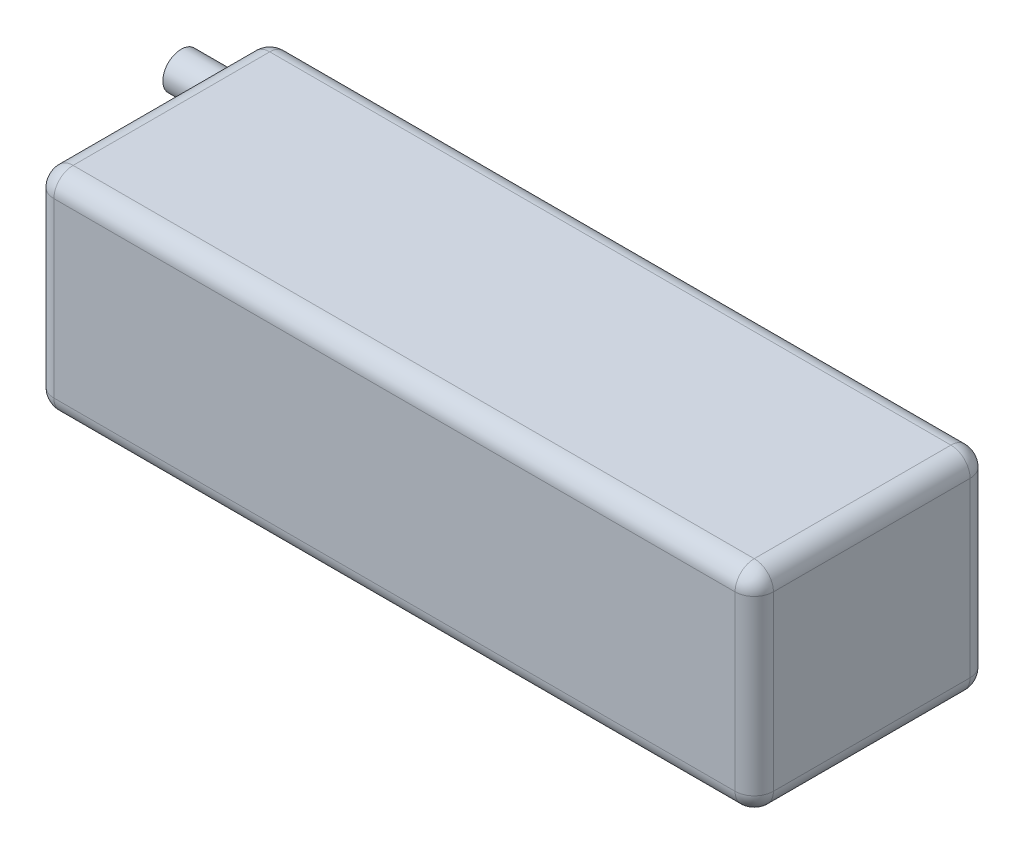
ISO-10303-21;
HEADER;
FILE_DESCRIPTION(('STEP AP214'),'2;1');
FILE_NAME('part.step','',(''),(''),'','','');
FILE_SCHEMA(('AUTOMOTIVE_DESIGN { 1 0 10303 214 1 1 1 1 }'));
ENDSEC;
DATA;
#1=APPLICATION_CONTEXT('core data for automotive mechanical design processes');
#2=APPLICATION_PROTOCOL_DEFINITION('international standard','automotive_design',2000,#1);
#3=PRODUCT_CONTEXT('',#1,'mechanical');
#4=PRODUCT('Part','Part','',(#3));
#5=PRODUCT_RELATED_PRODUCT_CATEGORY('part','',(#4));
#6=PRODUCT_DEFINITION_FORMATION('','',#4);
#7=PRODUCT_DEFINITION_CONTEXT('part definition',#1,'design');
#8=PRODUCT_DEFINITION('design','',#6,#7);
#9=PRODUCT_DEFINITION_SHAPE('','',#8);
#10=(LENGTH_UNIT() NAMED_UNIT(*) SI_UNIT(.MILLI.,.METRE.));
#11=(NAMED_UNIT(*) PLANE_ANGLE_UNIT() SI_UNIT($,.RADIAN.));
#12=(NAMED_UNIT(*) SI_UNIT($,.STERADIAN.) SOLID_ANGLE_UNIT());
#13=UNCERTAINTY_MEASURE_WITH_UNIT(LENGTH_MEASURE(1.E-05),#10,'distance_accuracy_value','');
#14=(GEOMETRIC_REPRESENTATION_CONTEXT(3) GLOBAL_UNCERTAINTY_ASSIGNED_CONTEXT((#13)) GLOBAL_UNIT_ASSIGNED_CONTEXT((#10,
#11,#12)) REPRESENTATION_CONTEXT('',''));
#15=CARTESIAN_POINT('',(0.,0.,0.));
#16=DIRECTION('',(0.,0.,1.));
#17=DIRECTION('',(1.,0.,0.));
#18=AXIS2_PLACEMENT_3D('',#15,#16,#17);
#19=CARTESIAN_POINT('',(-10.,8.90663853882688,-40.5294485767096));
#20=DIRECTION('',(1.,0.,0.));
#21=DIRECTION('',(0.,0.,-1.));
#22=AXIS2_PLACEMENT_3D('',#19,#20,#21);
#23=CYLINDRICAL_SURFACE('',#22,3.82449740501083);
#24=CARTESIAN_POINT('',(-10.,8.90663853882688,-40.5294485767096));
#25=DIRECTION('',(-1.,0.,0.));
#26=DIRECTION('',(0.,0.,1.));
#27=AXIS2_PLACEMENT_3D('',#24,#25,#26);
#28=CIRCLE('',#27,3.82449740501083);
#29=CARTESIAN_POINT('',(-10.,8.90663853882688,-36.7049511716987));
#30=VERTEX_POINT('',#29);
#31=EDGE_CURVE('E11',#30,#30,#28,.T.);
#32=ORIENTED_EDGE('',*,*,#31,.F.);
#33=EDGE_LOOP('',(#32));
#34=FACE_BOUND('',#33,.T.);
#35=CARTESIAN_POINT('',(0.,8.90663853882688,-40.5294485767096));
#36=DIRECTION('',(-1.,0.,0.));
#37=DIRECTION('',(0.,0.,1.));
#38=AXIS2_PLACEMENT_3D('',#35,#36,#37);
#39=CIRCLE('',#38,3.82449740501083);
#40=CARTESIAN_POINT('',(0.,8.90663853882688,-36.7049511716987));
#41=VERTEX_POINT('',#40);
#42=EDGE_CURVE('E65',#41,#41,#39,.T.);
#43=ORIENTED_EDGE('',*,*,#42,.T.);
#44=EDGE_LOOP('',(#43));
#45=FACE_BOUND('',#44,.T.);
#46=ADVANCED_FACE('F62',(#34,#45),#23,.T.);
#47=CARTESIAN_POINT('',(-10.,8.90663853882688,-40.5294485767096));
#48=DIRECTION('',(-1.,0.,0.));
#49=DIRECTION('',(0.,0.,1.));
#50=AXIS2_PLACEMENT_3D('',#47,#48,#49);
#51=PLANE('',#50);
#52=ORIENTED_EDGE('',*,*,#31,.T.);
#53=EDGE_LOOP('',(#52));
#54=FACE_BOUND('',#53,.T.);
#55=ADVANCED_FACE('F81',(#54),#51,.T.);
#56=CARTESIAN_POINT('',(0.,8.90663853882688,-40.5294485767096));
#57=DIRECTION('',(-1.,0.,0.));
#58=DIRECTION('',(0.,0.,1.));
#59=AXIS2_PLACEMENT_3D('',#56,#57,#58);
#60=PLANE('',#59);
#61=ORIENTED_EDGE('',*,*,#42,.F.);
#62=EDGE_LOOP('',(#61));
#63=FACE_BOUND('',#62,.T.);
#64=ADVANCED_FACE('F79',(#63),#60,.F.);
#65=CLOSED_SHELL('',(#46,#55,#64));
#66=MANIFOLD_SOLID_BREP('B2',#65);
#67=CARTESIAN_POINT('',(-10.,35.8868985194271,-40.5294485767096));
#68=DIRECTION('',(1.,0.,0.));
#69=DIRECTION('',(0.,0.,-1.));
#70=AXIS2_PLACEMENT_3D('',#67,#68,#69);
#71=CYLINDRICAL_SURFACE('',#70,3.82449740501083);
#72=CARTESIAN_POINT('',(-10.,35.8868985194271,-40.5294485767096));
#73=DIRECTION('',(-1.,0.,0.));
#74=DIRECTION('',(0.,0.,1.));
#75=AXIS2_PLACEMENT_3D('',#72,#73,#74);
#76=CIRCLE('',#75,3.82449740501083);
#77=CARTESIAN_POINT('',(-10.,35.8868985194271,-36.7049511716987));
#78=VERTEX_POINT('',#77);
#79=EDGE_CURVE('E61',#78,#78,#76,.T.);
#80=ORIENTED_EDGE('',*,*,#79,.F.);
#81=EDGE_LOOP('',(#80));
#82=FACE_BOUND('',#81,.T.);
#83=CARTESIAN_POINT('',(0.,35.8868985194271,-40.5294485767096));
#84=DIRECTION('',(-1.,0.,0.));
#85=DIRECTION('',(0.,0.,1.));
#86=AXIS2_PLACEMENT_3D('',#83,#84,#85);
#87=CIRCLE('',#86,3.82449740501083);
#88=CARTESIAN_POINT('',(0.,35.8868985194271,-36.7049511716987));
#89=VERTEX_POINT('',#88);
#90=EDGE_CURVE('E119',#89,#89,#87,.T.);
#91=ORIENTED_EDGE('',*,*,#90,.T.);
#92=EDGE_LOOP('',(#91));
#93=FACE_BOUND('',#92,.T.);
#94=ADVANCED_FACE('F116',(#82,#93),#71,.T.);
#95=CARTESIAN_POINT('',(-10.,35.8868985194271,-40.5294485767096));
#96=DIRECTION('',(-1.,0.,0.));
#97=DIRECTION('',(0.,0.,1.));
#98=AXIS2_PLACEMENT_3D('',#95,#96,#97);
#99=PLANE('',#98);
#100=ORIENTED_EDGE('',*,*,#79,.T.);
#101=EDGE_LOOP('',(#100));
#102=FACE_BOUND('',#101,.T.);
#103=ADVANCED_FACE('F135',(#102),#99,.T.);
#104=CARTESIAN_POINT('',(0.,35.8868985194271,-40.5294485767096));
#105=DIRECTION('',(-1.,0.,0.));
#106=DIRECTION('',(0.,0.,1.));
#107=AXIS2_PLACEMENT_3D('',#104,#105,#106);
#108=PLANE('',#107);
#109=ORIENTED_EDGE('',*,*,#90,.F.);
#110=EDGE_LOOP('',(#109));
#111=FACE_BOUND('',#110,.T.);
#112=ADVANCED_FACE('F133',(#111),#108,.F.);
#113=CLOSED_SHELL('',(#94,#103,#112));
#114=MANIFOLD_SOLID_BREP('B6',#113);
#115=CARTESIAN_POINT('',(0.,44.,0.));
#116=DIRECTION('',(1.,0.,0.));
#117=DIRECTION('',(0.,0.,-1.));
#118=AXIS2_PLACEMENT_3D('',#115,#116,#117);
#119=PLANE('',#118);
#120=DIRECTION('',(0.,-1.,0.));
#121=VECTOR('',#120,1.);
#122=CARTESIAN_POINT('',(0.,44.,-4.));
#123=LINE('',#122,#121);
#124=CARTESIAN_POINT('',(0.,4.,-4.));
#125=VERTEX_POINT('',#124);
#126=CARTESIAN_POINT('',(0.,40.,-4.));
#127=VERTEX_POINT('',#126);
#128=EDGE_CURVE('E325',#125,#127,#123,.F.);
#129=ORIENTED_EDGE('',*,*,#128,.T.);
#130=DIRECTION('',(0.,0.,1.));
#131=VECTOR('',#130,1.);
#132=CARTESIAN_POINT('',(0.,40.,0.));
#133=LINE('',#132,#131);
#134=CARTESIAN_POINT('',(0.,40.,-45.));
#135=VERTEX_POINT('',#134);
#136=EDGE_CURVE('E328',#127,#135,#133,.F.);
#137=ORIENTED_EDGE('',*,*,#136,.T.);
#138=DIRECTION('',(0.,-1.,0.));
#139=VECTOR('',#138,1.);
#140=CARTESIAN_POINT('',(0.,44.,-45.));
#141=LINE('',#140,#139);
#142=CARTESIAN_POINT('',(0.,4.,-45.));
#143=VERTEX_POINT('',#142);
#144=EDGE_CURVE('E319',#135,#143,#141,.T.);
#145=ORIENTED_EDGE('',*,*,#144,.T.);
#146=DIRECTION('',(0.,0.,1.));
#147=VECTOR('',#146,1.);
#148=CARTESIAN_POINT('',(0.,4.,0.));
#149=LINE('',#148,#147);
#150=EDGE_CURVE('E322',#143,#125,#149,.T.);
#151=ORIENTED_EDGE('',*,*,#150,.T.);
#152=EDGE_LOOP('',(#129,#137,#145,#151));
#153=FACE_BOUND('',#152,.T.);
#154=ADVANCED_FACE('F161',(#153),#119,.F.);
#155=CARTESIAN_POINT('',(0.,44.,0.));
#156=DIRECTION('',(0.,0.,-1.));
#157=DIRECTION('',(-1.,0.,0.));
#158=AXIS2_PLACEMENT_3D('',#155,#156,#157);
#159=PLANE('',#158);
#160=DIRECTION('',(0.,-1.,0.));
#161=VECTOR('',#160,1.);
#162=CARTESIAN_POINT('',(146.,44.,0.));
#163=LINE('',#162,#161);
#164=CARTESIAN_POINT('',(146.,4.,0.));
#165=VERTEX_POINT('',#164);
#166=CARTESIAN_POINT('',(146.,40.,0.));
#167=VERTEX_POINT('',#166);
#168=EDGE_CURVE('E312',#165,#167,#163,.F.);
#169=ORIENTED_EDGE('',*,*,#168,.T.);
#170=DIRECTION('',(1.,0.,0.));
#171=VECTOR('',#170,1.);
#172=CARTESIAN_POINT('',(0.,40.,0.));
#173=LINE('',#172,#171);
#174=CARTESIAN_POINT('',(4.,40.,0.));
#175=VERTEX_POINT('',#174);
#176=EDGE_CURVE('E315',#167,#175,#173,.F.);
#177=ORIENTED_EDGE('',*,*,#176,.T.);
#178=DIRECTION('',(0.,-1.,0.));
#179=VECTOR('',#178,1.);
#180=CARTESIAN_POINT('',(4.,44.,0.));
#181=LINE('',#180,#179);
#182=CARTESIAN_POINT('',(4.,4.,0.));
#183=VERTEX_POINT('',#182);
#184=EDGE_CURVE('E309',#175,#183,#181,.T.);
#185=ORIENTED_EDGE('',*,*,#184,.T.);
#186=DIRECTION('',(1.,0.,0.));
#187=VECTOR('',#186,1.);
#188=CARTESIAN_POINT('',(150.,4.,0.));
#189=LINE('',#188,#187);
#190=EDGE_CURVE('E306',#183,#165,#189,.T.);
#191=ORIENTED_EDGE('',*,*,#190,.T.);
#192=EDGE_LOOP('',(#169,#177,#185,#191));
#193=FACE_BOUND('',#192,.T.);
#194=ADVANCED_FACE('F464',(#193),#159,.F.);
#195=CARTESIAN_POINT('',(150.,44.,0.));
#196=DIRECTION('',(-1.,0.,0.));
#197=DIRECTION('',(0.,0.,1.));
#198=AXIS2_PLACEMENT_3D('',#195,#196,#197);
#199=PLANE('',#198);
#200=DIRECTION('',(0.,-1.,0.));
#201=VECTOR('',#200,1.);
#202=CARTESIAN_POINT('',(150.,44.,-45.));
#203=LINE('',#202,#201);
#204=CARTESIAN_POINT('',(150.,4.,-45.));
#205=VERTEX_POINT('',#204);
#206=CARTESIAN_POINT('',(150.,40.,-45.));
#207=VERTEX_POINT('',#206);
#208=EDGE_CURVE('E289',#205,#207,#203,.F.);
#209=ORIENTED_EDGE('',*,*,#208,.T.);
#210=DIRECTION('',(0.,0.,-1.));
#211=VECTOR('',#210,1.);
#212=CARTESIAN_POINT('',(150.,40.,0.));
#213=LINE('',#212,#211);
#214=CARTESIAN_POINT('',(150.,40.,-4.));
#215=VERTEX_POINT('',#214);
#216=EDGE_CURVE('E258',#207,#215,#213,.F.);
#217=ORIENTED_EDGE('',*,*,#216,.T.);
#218=DIRECTION('',(0.,-1.,0.));
#219=VECTOR('',#218,1.);
#220=CARTESIAN_POINT('',(150.,44.,-4.));
#221=LINE('',#220,#219);
#222=CARTESIAN_POINT('',(150.,4.,-4.));
#223=VERTEX_POINT('',#222);
#224=EDGE_CURVE('E301',#215,#223,#221,.T.);
#225=ORIENTED_EDGE('',*,*,#224,.T.);
#226=DIRECTION('',(0.,0.,-1.));
#227=VECTOR('',#226,1.);
#228=CARTESIAN_POINT('',(150.,4.,-49.));
#229=LINE('',#228,#227);
#230=EDGE_CURVE('E294',#223,#205,#229,.T.);
#231=ORIENTED_EDGE('',*,*,#230,.T.);
#232=EDGE_LOOP('',(#209,#217,#225,#231));
#233=FACE_BOUND('',#232,.T.);
#234=ADVANCED_FACE('F497',(#233),#199,.F.);
#235=CARTESIAN_POINT('',(0.,44.,-49.));
#236=DIRECTION('',(0.,0.,1.));
#237=DIRECTION('',(1.,0.,0.));
#238=AXIS2_PLACEMENT_3D('',#235,#236,#237);
#239=PLANE('',#238);
#240=DIRECTION('',(-1.,0.,0.));
#241=VECTOR('',#240,1.);
#242=CARTESIAN_POINT('',(0.,40.,-49.));
#243=LINE('',#242,#241);
#244=CARTESIAN_POINT('',(4.,40.,-49.));
#245=VERTEX_POINT('',#244);
#246=CARTESIAN_POINT('',(146.,40.,-49.));
#247=VERTEX_POINT('',#246);
#248=EDGE_CURVE('E171',#245,#247,#243,.F.);
#249=ORIENTED_EDGE('',*,*,#248,.T.);
#250=DIRECTION('',(0.,-1.,0.));
#251=VECTOR('',#250,1.);
#252=CARTESIAN_POINT('',(146.,44.,-49.));
#253=LINE('',#252,#251);
#254=CARTESIAN_POINT('',(146.,4.,-49.));
#255=VERTEX_POINT('',#254);
#256=EDGE_CURVE('E114',#247,#255,#253,.T.);
#257=ORIENTED_EDGE('',*,*,#256,.T.);
#258=DIRECTION('',(-1.,0.,0.));
#259=VECTOR('',#258,1.);
#260=CARTESIAN_POINT('',(0.,4.,-49.));
#261=LINE('',#260,#259);
#262=CARTESIAN_POINT('',(4.,4.,-49.));
#263=VERTEX_POINT('',#262);
#264=EDGE_CURVE('E345',#255,#263,#261,.T.);
#265=ORIENTED_EDGE('',*,*,#264,.T.);
#266=DIRECTION('',(0.,-1.,0.));
#267=VECTOR('',#266,1.);
#268=CARTESIAN_POINT('',(4.,44.,-49.));
#269=LINE('',#268,#267);
#270=EDGE_CURVE('E182',#263,#245,#269,.F.);
#271=ORIENTED_EDGE('',*,*,#270,.T.);
#272=EDGE_LOOP('',(#249,#257,#265,#271));
#273=FACE_BOUND('',#272,.T.);
#274=ADVANCED_FACE('F499',(#273),#239,.F.);
#275=CARTESIAN_POINT('',(0.,44.,0.));
#276=DIRECTION('',(0.,-1.,0.));
#277=DIRECTION('',(0.,0.,-1.));
#278=AXIS2_PLACEMENT_3D('',#275,#276,#277);
#279=PLANE('',#278);
#280=DIRECTION('',(1.,0.,0.));
#281=VECTOR('',#280,1.);
#282=CARTESIAN_POINT('',(0.,44.,-4.));
#283=LINE('',#282,#281);
#284=CARTESIAN_POINT('',(4.,44.,-4.));
#285=VERTEX_POINT('',#284);
#286=CARTESIAN_POINT('',(146.,44.,-4.));
#287=VERTEX_POINT('',#286);
#288=EDGE_CURVE('E286',#285,#287,#283,.T.);
#289=ORIENTED_EDGE('',*,*,#288,.T.);
#290=DIRECTION('',(0.,0.,-1.));
#291=VECTOR('',#290,1.);
#292=CARTESIAN_POINT('',(146.,44.,0.));
#293=LINE('',#292,#291);
#294=CARTESIAN_POINT('',(146.,44.,-45.));
#295=VERTEX_POINT('',#294);
#296=EDGE_CURVE('E256',#287,#295,#293,.T.);
#297=ORIENTED_EDGE('',*,*,#296,.T.);
#298=DIRECTION('',(-1.,0.,0.));
#299=VECTOR('',#298,1.);
#300=CARTESIAN_POINT('',(0.,44.,-45.));
#301=LINE('',#300,#299);
#302=CARTESIAN_POINT('',(4.,44.,-45.));
#303=VERTEX_POINT('',#302);
#304=EDGE_CURVE('E275',#295,#303,#301,.T.);
#305=ORIENTED_EDGE('',*,*,#304,.T.);
#306=DIRECTION('',(0.,0.,1.));
#307=VECTOR('',#306,1.);
#308=CARTESIAN_POINT('',(4.,44.,0.));
#309=LINE('',#308,#307);
#310=EDGE_CURVE('E282',#303,#285,#309,.T.);
#311=ORIENTED_EDGE('',*,*,#310,.T.);
#312=EDGE_LOOP('',(#289,#297,#305,#311));
#313=FACE_BOUND('',#312,.T.);
#314=ADVANCED_FACE('F284',(#313),#279,.F.);
#315=CARTESIAN_POINT('',(0.,0.,0.));
#316=DIRECTION('',(0.,-1.,0.));
#317=DIRECTION('',(0.,0.,-1.));
#318=AXIS2_PLACEMENT_3D('',#315,#316,#317);
#319=PLANE('',#318);
#320=DIRECTION('',(0.,0.,-1.));
#321=VECTOR('',#320,1.);
#322=CARTESIAN_POINT('',(146.,0.,0.));
#323=LINE('',#322,#321);
#324=CARTESIAN_POINT('',(146.,0.,-45.));
#325=VERTEX_POINT('',#324);
#326=CARTESIAN_POINT('',(146.,0.,-4.));
#327=VERTEX_POINT('',#326);
#328=EDGE_CURVE('E338',#325,#327,#323,.F.);
#329=ORIENTED_EDGE('',*,*,#328,.T.);
#330=DIRECTION('',(1.,0.,0.));
#331=VECTOR('',#330,1.);
#332=CARTESIAN_POINT('',(0.,0.,-4.));
#333=LINE('',#332,#331);
#334=CARTESIAN_POINT('',(4.,0.,-4.));
#335=VERTEX_POINT('',#334);
#336=EDGE_CURVE('E341',#327,#335,#333,.F.);
#337=ORIENTED_EDGE('',*,*,#336,.T.);
#338=DIRECTION('',(0.,0.,1.));
#339=VECTOR('',#338,1.);
#340=CARTESIAN_POINT('',(4.,0.,-49.));
#341=LINE('',#340,#339);
#342=CARTESIAN_POINT('',(4.,0.,-45.));
#343=VERTEX_POINT('',#342);
#344=EDGE_CURVE('E335',#335,#343,#341,.F.);
#345=ORIENTED_EDGE('',*,*,#344,.T.);
#346=DIRECTION('',(-1.,0.,0.));
#347=VECTOR('',#346,1.);
#348=CARTESIAN_POINT('',(150.,0.,-45.));
#349=LINE('',#348,#347);
#350=EDGE_CURVE('E332',#343,#325,#349,.F.);
#351=ORIENTED_EDGE('',*,*,#350,.T.);
#352=EDGE_LOOP('',(#329,#337,#345,#351));
#353=FACE_BOUND('',#352,.T.);
#354=ADVANCED_FACE('F443',(#353),#319,.T.);
#355=CARTESIAN_POINT('',(4.,4.,0.));
#356=DIRECTION('',(0.,0.,-1.));
#357=DIRECTION('',(-1.,0.,0.));
#358=AXIS2_PLACEMENT_3D('',#355,#356,#357);
#359=CYLINDRICAL_SURFACE('',#358,4.);
#360=CARTESIAN_POINT('',(4.,4.,-4.));
#361=DIRECTION('',(0.,0.,1.));
#362=DIRECTION('',(1.,0.,0.));
#363=AXIS2_PLACEMENT_3D('',#360,#361,#362);
#364=CIRCLE('',#363,4.);
#365=EDGE_CURVE('E165',#125,#335,#364,.T.);
#366=ORIENTED_EDGE('',*,*,#365,.F.);
#367=ORIENTED_EDGE('',*,*,#150,.F.);
#368=CARTESIAN_POINT('',(4.,4.,-45.));
#369=DIRECTION('',(0.,0.,-1.));
#370=DIRECTION('',(-1.,0.,0.));
#371=AXIS2_PLACEMENT_3D('',#368,#369,#370);
#372=CIRCLE('',#371,4.);
#373=EDGE_CURVE('E420',#343,#143,#372,.T.);
#374=ORIENTED_EDGE('',*,*,#373,.F.);
#375=ORIENTED_EDGE('',*,*,#344,.F.);
#376=EDGE_LOOP('',(#366,#367,#374,#375));
#377=FACE_BOUND('',#376,.T.);
#378=ADVANCED_FACE('F163',(#377),#359,.T.);
#379=CARTESIAN_POINT('',(4.,4.,-4.));
#380=DIRECTION('',(0.,-1.,0.));
#381=DIRECTION('',(0.,0.,-1.));
#382=AXIS2_PLACEMENT_3D('',#379,#380,#381);
#383=SPHERICAL_SURFACE('',#382,4.);
#384=CARTESIAN_POINT('',(4.,4.,-4.));
#385=DIRECTION('',(0.,-1.,0.));
#386=DIRECTION('',(0.,0.,-1.));
#387=AXIS2_PLACEMENT_3D('',#384,#385,#386);
#388=CIRCLE('',#387,4.);
#389=EDGE_CURVE('E414',#125,#183,#388,.F.);
#390=ORIENTED_EDGE('',*,*,#389,.F.);
#391=ORIENTED_EDGE('',*,*,#365,.T.);
#392=CARTESIAN_POINT('',(4.,4.,-4.));
#393=DIRECTION('',(-1.,0.,0.));
#394=DIRECTION('',(0.,0.,1.));
#395=AXIS2_PLACEMENT_3D('',#392,#393,#394);
#396=CIRCLE('',#395,4.);
#397=EDGE_CURVE('E418',#183,#335,#396,.F.);
#398=ORIENTED_EDGE('',*,*,#397,.F.);
#399=EDGE_LOOP('',(#390,#391,#398));
#400=FACE_BOUND('',#399,.T.);
#401=ADVANCED_FACE('F436',(#400),#383,.T.);
#402=CARTESIAN_POINT('',(4.,4.,-45.));
#403=DIRECTION('',(-1.,0.,0.));
#404=DIRECTION('',(0.,-1.,0.));
#405=AXIS2_PLACEMENT_3D('',#402,#403,#404);
#406=SPHERICAL_SURFACE('',#405,4.);
#407=CARTESIAN_POINT('',(4.,4.,-45.));
#408=DIRECTION('',(-1.,0.,0.));
#409=DIRECTION('',(0.,0.,1.));
#410=AXIS2_PLACEMENT_3D('',#407,#408,#409);
#411=CIRCLE('',#410,4.);
#412=EDGE_CURVE('E406',#343,#263,#411,.F.);
#413=ORIENTED_EDGE('',*,*,#412,.F.);
#414=ORIENTED_EDGE('',*,*,#373,.T.);
#415=CARTESIAN_POINT('',(4.,4.,-45.));
#416=DIRECTION('',(0.,-1.,0.));
#417=DIRECTION('',(0.,0.,-1.));
#418=AXIS2_PLACEMENT_3D('',#415,#416,#417);
#419=CIRCLE('',#418,4.);
#420=EDGE_CURVE('E410',#263,#143,#419,.F.);
#421=ORIENTED_EDGE('',*,*,#420,.F.);
#422=EDGE_LOOP('',(#413,#414,#421));
#423=FACE_BOUND('',#422,.T.);
#424=ADVANCED_FACE('F485',(#423),#406,.T.);
#425=CARTESIAN_POINT('',(0.,4.,-4.));
#426=DIRECTION('',(-1.,0.,0.));
#427=DIRECTION('',(0.,0.,1.));
#428=AXIS2_PLACEMENT_3D('',#425,#426,#427);
#429=CYLINDRICAL_SURFACE('',#428,4.);
#430=ORIENTED_EDGE('',*,*,#397,.T.);
#431=ORIENTED_EDGE('',*,*,#336,.F.);
#432=CARTESIAN_POINT('',(146.,4.,-4.));
#433=DIRECTION('',(1.,0.,0.));
#434=DIRECTION('',(0.,0.,-1.));
#435=AXIS2_PLACEMENT_3D('',#432,#433,#434);
#436=CIRCLE('',#435,4.);
#437=EDGE_CURVE('E398',#165,#327,#436,.T.);
#438=ORIENTED_EDGE('',*,*,#437,.F.);
#439=ORIENTED_EDGE('',*,*,#190,.F.);
#440=EDGE_LOOP('',(#430,#431,#438,#439));
#441=FACE_BOUND('',#440,.T.);
#442=ADVANCED_FACE('F448',(#441),#429,.T.);
#443=CARTESIAN_POINT('',(4.,44.,-4.));
#444=DIRECTION('',(0.,-1.,0.));
#445=DIRECTION('',(0.,0.,-1.));
#446=AXIS2_PLACEMENT_3D('',#443,#444,#445);
#447=CYLINDRICAL_SURFACE('',#446,4.);
#448=ORIENTED_EDGE('',*,*,#389,.T.);
#449=ORIENTED_EDGE('',*,*,#184,.F.);
#450=CARTESIAN_POINT('',(4.,40.,-4.));
#451=DIRECTION('',(0.,1.,0.));
#452=DIRECTION('',(0.,0.,1.));
#453=AXIS2_PLACEMENT_3D('',#450,#451,#452);
#454=CIRCLE('',#453,4.);
#455=EDGE_CURVE('E394',#127,#175,#454,.T.);
#456=ORIENTED_EDGE('',*,*,#455,.F.);
#457=ORIENTED_EDGE('',*,*,#128,.F.);
#458=EDGE_LOOP('',(#448,#449,#456,#457));
#459=FACE_BOUND('',#458,.T.);
#460=ADVANCED_FACE('F475',(#459),#447,.T.);
#461=CARTESIAN_POINT('',(4.,40.,0.));
#462=DIRECTION('',(0.,0.,1.));
#463=DIRECTION('',(1.,0.,0.));
#464=AXIS2_PLACEMENT_3D('',#461,#462,#463);
#465=CYLINDRICAL_SURFACE('',#464,4.);
#466=CARTESIAN_POINT('',(4.,40.,-45.));
#467=DIRECTION('',(0.,0.,-1.));
#468=DIRECTION('',(-1.,0.,0.));
#469=AXIS2_PLACEMENT_3D('',#466,#467,#468);
#470=CIRCLE('',#469,4.);
#471=EDGE_CURVE('E386',#135,#303,#470,.T.);
#472=ORIENTED_EDGE('',*,*,#471,.F.);
#473=ORIENTED_EDGE('',*,*,#136,.F.);
#474=CARTESIAN_POINT('',(4.,40.,-4.));
#475=DIRECTION('',(0.,0.,1.));
#476=DIRECTION('',(1.,0.,0.));
#477=AXIS2_PLACEMENT_3D('',#474,#475,#476);
#478=CIRCLE('',#477,4.);
#479=EDGE_CURVE('E390',#285,#127,#478,.T.);
#480=ORIENTED_EDGE('',*,*,#479,.F.);
#481=ORIENTED_EDGE('',*,*,#310,.F.);
#482=EDGE_LOOP('',(#472,#473,#480,#481));
#483=FACE_BOUND('',#482,.T.);
#484=ADVANCED_FACE('F480',(#483),#465,.T.);
#485=CARTESIAN_POINT('',(4.,44.,-45.));
#486=DIRECTION('',(0.,-1.,0.));
#487=DIRECTION('',(0.,0.,-1.));
#488=AXIS2_PLACEMENT_3D('',#485,#486,#487);
#489=CYLINDRICAL_SURFACE('',#488,4.);
#490=ORIENTED_EDGE('',*,*,#420,.T.);
#491=ORIENTED_EDGE('',*,*,#144,.F.);
#492=CARTESIAN_POINT('',(4.,40.,-45.));
#493=DIRECTION('',(0.,1.,0.));
#494=DIRECTION('',(0.,0.,1.));
#495=AXIS2_PLACEMENT_3D('',#492,#493,#494);
#496=CIRCLE('',#495,4.);
#497=EDGE_CURVE('E383',#245,#135,#496,.T.);
#498=ORIENTED_EDGE('',*,*,#497,.F.);
#499=ORIENTED_EDGE('',*,*,#270,.F.);
#500=EDGE_LOOP('',(#490,#491,#498,#499));
#501=FACE_BOUND('',#500,.T.);
#502=ADVANCED_FACE('F484',(#501),#489,.T.);
#503=CARTESIAN_POINT('',(0.,4.,-45.));
#504=DIRECTION('',(1.,0.,0.));
#505=DIRECTION('',(0.,0.,-1.));
#506=AXIS2_PLACEMENT_3D('',#503,#504,#505);
#507=CYLINDRICAL_SURFACE('',#506,4.);
#508=ORIENTED_EDGE('',*,*,#412,.T.);
#509=ORIENTED_EDGE('',*,*,#264,.F.);
#510=CARTESIAN_POINT('',(146.,4.,-45.));
#511=DIRECTION('',(1.,0.,0.));
#512=DIRECTION('',(0.,0.,-1.));
#513=AXIS2_PLACEMENT_3D('',#510,#511,#512);
#514=CIRCLE('',#513,4.);
#515=EDGE_CURVE('E379',#325,#255,#514,.T.);
#516=ORIENTED_EDGE('',*,*,#515,.F.);
#517=ORIENTED_EDGE('',*,*,#350,.F.);
#518=EDGE_LOOP('',(#508,#509,#516,#517));
#519=FACE_BOUND('',#518,.T.);
#520=ADVANCED_FACE('F489',(#519),#507,.T.);
#521=CARTESIAN_POINT('',(146.,4.,0.));
#522=DIRECTION('',(0.,0.,1.));
#523=DIRECTION('',(1.,0.,0.));
#524=AXIS2_PLACEMENT_3D('',#521,#522,#523);
#525=CYLINDRICAL_SURFACE('',#524,4.);
#526=CARTESIAN_POINT('',(146.,4.,-4.));
#527=DIRECTION('',(0.,0.,1.));
#528=DIRECTION('',(1.,0.,0.));
#529=AXIS2_PLACEMENT_3D('',#526,#527,#528);
#530=CIRCLE('',#529,4.);
#531=EDGE_CURVE('E402',#327,#223,#530,.T.);
#532=ORIENTED_EDGE('',*,*,#531,.F.);
#533=ORIENTED_EDGE('',*,*,#328,.F.);
#534=CARTESIAN_POINT('',(146.,4.,-45.));
#535=DIRECTION('',(0.,0.,-1.));
#536=DIRECTION('',(-1.,0.,0.));
#537=AXIS2_PLACEMENT_3D('',#534,#535,#536);
#538=CIRCLE('',#537,4.);
#539=EDGE_CURVE('E375',#205,#325,#538,.T.);
#540=ORIENTED_EDGE('',*,*,#539,.F.);
#541=ORIENTED_EDGE('',*,*,#230,.F.);
#542=EDGE_LOOP('',(#532,#533,#540,#541));
#543=FACE_BOUND('',#542,.T.);
#544=ADVANCED_FACE('F452',(#543),#525,.T.);
#545=CARTESIAN_POINT('',(146.,4.,-4.));
#546=DIRECTION('',(0.,-1.,0.));
#547=DIRECTION('',(0.,0.,-1.));
#548=AXIS2_PLACEMENT_3D('',#545,#546,#547);
#549=SPHERICAL_SURFACE('',#548,4.);
#550=ORIENTED_EDGE('',*,*,#437,.T.);
#551=ORIENTED_EDGE('',*,*,#531,.T.);
#552=CARTESIAN_POINT('',(146.,4.,-4.));
#553=DIRECTION('',(0.,-1.,0.));
#554=DIRECTION('',(0.,0.,-1.));
#555=AXIS2_PLACEMENT_3D('',#552,#553,#554);
#556=CIRCLE('',#555,4.);
#557=EDGE_CURVE('E371',#165,#223,#556,.F.);
#558=ORIENTED_EDGE('',*,*,#557,.F.);
#559=EDGE_LOOP('',(#550,#551,#558));
#560=FACE_BOUND('',#559,.T.);
#561=ADVANCED_FACE('F456',(#560),#549,.T.);
#562=CARTESIAN_POINT('',(4.,40.,-4.));
#563=DIRECTION('',(-1.,0.,0.));
#564=DIRECTION('',(0.,0.,1.));
#565=AXIS2_PLACEMENT_3D('',#562,#563,#564);
#566=SPHERICAL_SURFACE('',#565,4.);
#567=ORIENTED_EDGE('',*,*,#479,.T.);
#568=ORIENTED_EDGE('',*,*,#455,.T.);
#569=CARTESIAN_POINT('',(4.,40.,-4.));
#570=DIRECTION('',(-1.,0.,0.));
#571=DIRECTION('',(0.,0.,1.));
#572=AXIS2_PLACEMENT_3D('',#569,#570,#571);
#573=CIRCLE('',#572,4.);
#574=EDGE_CURVE('E368',#285,#175,#573,.F.);
#575=ORIENTED_EDGE('',*,*,#574,.F.);
#576=EDGE_LOOP('',(#567,#568,#575));
#577=FACE_BOUND('',#576,.T.);
#578=ADVANCED_FACE('F472',(#577),#566,.T.);
#579=CARTESIAN_POINT('',(4.,40.,-45.));
#580=DIRECTION('',(-1.,0.,0.));
#581=DIRECTION('',(0.,0.,1.));
#582=AXIS2_PLACEMENT_3D('',#579,#580,#581);
#583=SPHERICAL_SURFACE('',#582,4.);
#584=ORIENTED_EDGE('',*,*,#497,.T.);
#585=ORIENTED_EDGE('',*,*,#471,.T.);
#586=CARTESIAN_POINT('',(4.,40.,-45.));
#587=DIRECTION('',(-1.,0.,0.));
#588=DIRECTION('',(0.,0.,1.));
#589=AXIS2_PLACEMENT_3D('',#586,#587,#588);
#590=CIRCLE('',#589,4.);
#591=EDGE_CURVE('E278',#245,#303,#590,.F.);
#592=ORIENTED_EDGE('',*,*,#591,.F.);
#593=EDGE_LOOP('',(#584,#585,#592));
#594=FACE_BOUND('',#593,.T.);
#595=ADVANCED_FACE('F531',(#594),#583,.T.);
#596=CARTESIAN_POINT('',(146.,4.,-45.));
#597=DIRECTION('',(0.,-1.,0.));
#598=DIRECTION('',(0.,0.,-1.));
#599=AXIS2_PLACEMENT_3D('',#596,#597,#598);
#600=SPHERICAL_SURFACE('',#599,4.);
#601=ORIENTED_EDGE('',*,*,#539,.T.);
#602=ORIENTED_EDGE('',*,*,#515,.T.);
#603=CARTESIAN_POINT('',(146.,4.,-45.));
#604=DIRECTION('',(0.,-1.,0.));
#605=DIRECTION('',(0.,0.,-1.));
#606=AXIS2_PLACEMENT_3D('',#603,#604,#605);
#607=CIRCLE('',#606,4.);
#608=EDGE_CURVE('E363',#205,#255,#607,.F.);
#609=ORIENTED_EDGE('',*,*,#608,.F.);
#610=EDGE_LOOP('',(#601,#602,#609));
#611=FACE_BOUND('',#610,.T.);
#612=ADVANCED_FACE('F492',(#611),#600,.T.);
#613=CARTESIAN_POINT('',(146.,44.,-4.));
#614=DIRECTION('',(0.,-1.,0.));
#615=DIRECTION('',(0.,0.,-1.));
#616=AXIS2_PLACEMENT_3D('',#613,#614,#615);
#617=CYLINDRICAL_SURFACE('',#616,4.);
#618=ORIENTED_EDGE('',*,*,#557,.T.);
#619=ORIENTED_EDGE('',*,*,#224,.F.);
#620=CARTESIAN_POINT('',(146.,40.,-4.));
#621=DIRECTION('',(0.,1.,0.));
#622=DIRECTION('',(0.,0.,1.));
#623=AXIS2_PLACEMENT_3D('',#620,#621,#622);
#624=CIRCLE('',#623,4.);
#625=EDGE_CURVE('E359',#167,#215,#624,.T.);
#626=ORIENTED_EDGE('',*,*,#625,.F.);
#627=ORIENTED_EDGE('',*,*,#168,.F.);
#628=EDGE_LOOP('',(#618,#619,#626,#627));
#629=FACE_BOUND('',#628,.T.);
#630=ADVANCED_FACE('F461',(#629),#617,.T.);
#631=CARTESIAN_POINT('',(0.,40.,-4.));
#632=DIRECTION('',(1.,0.,0.));
#633=DIRECTION('',(0.,0.,-1.));
#634=AXIS2_PLACEMENT_3D('',#631,#632,#633);
#635=CYLINDRICAL_SURFACE('',#634,4.);
#636=ORIENTED_EDGE('',*,*,#574,.T.);
#637=ORIENTED_EDGE('',*,*,#176,.F.);
#638=CARTESIAN_POINT('',(146.,40.,-4.));
#639=DIRECTION('',(1.,0.,0.));
#640=DIRECTION('',(0.,0.,-1.));
#641=AXIS2_PLACEMENT_3D('',#638,#639,#640);
#642=CIRCLE('',#641,4.);
#643=EDGE_CURVE('E272',#287,#167,#642,.T.);
#644=ORIENTED_EDGE('',*,*,#643,.F.);
#645=ORIENTED_EDGE('',*,*,#288,.F.);
#646=EDGE_LOOP('',(#636,#637,#644,#645));
#647=FACE_BOUND('',#646,.T.);
#648=ADVANCED_FACE('F466',(#647),#635,.T.);
#649=CARTESIAN_POINT('',(0.,40.,-45.));
#650=DIRECTION('',(-1.,0.,0.));
#651=DIRECTION('',(0.,0.,1.));
#652=AXIS2_PLACEMENT_3D('',#649,#650,#651);
#653=CYLINDRICAL_SURFACE('',#652,4.);
#654=ORIENTED_EDGE('',*,*,#591,.T.);
#655=ORIENTED_EDGE('',*,*,#304,.F.);
#656=CARTESIAN_POINT('',(146.,40.,-45.));
#657=DIRECTION('',(1.,0.,0.));
#658=DIRECTION('',(0.,0.,-1.));
#659=AXIS2_PLACEMENT_3D('',#656,#657,#658);
#660=CIRCLE('',#659,4.);
#661=EDGE_CURVE('E265',#247,#295,#660,.T.);
#662=ORIENTED_EDGE('',*,*,#661,.F.);
#663=ORIENTED_EDGE('',*,*,#248,.F.);
#664=EDGE_LOOP('',(#654,#655,#662,#663));
#665=FACE_BOUND('',#664,.T.);
#666=ADVANCED_FACE('F276',(#665),#653,.T.);
#667=CARTESIAN_POINT('',(146.,44.,-45.));
#668=DIRECTION('',(0.,-1.,0.));
#669=DIRECTION('',(0.,0.,-1.));
#670=AXIS2_PLACEMENT_3D('',#667,#668,#669);
#671=CYLINDRICAL_SURFACE('',#670,4.);
#672=ORIENTED_EDGE('',*,*,#608,.T.);
#673=ORIENTED_EDGE('',*,*,#256,.F.);
#674=CARTESIAN_POINT('',(146.,40.,-45.));
#675=DIRECTION('',(0.,1.,0.));
#676=DIRECTION('',(0.,0.,1.));
#677=AXIS2_PLACEMENT_3D('',#674,#675,#676);
#678=CIRCLE('',#677,4.);
#679=EDGE_CURVE('E269',#207,#247,#678,.T.);
#680=ORIENTED_EDGE('',*,*,#679,.F.);
#681=ORIENTED_EDGE('',*,*,#208,.F.);
#682=EDGE_LOOP('',(#672,#673,#680,#681));
#683=FACE_BOUND('',#682,.T.);
#684=ADVANCED_FACE('F495',(#683),#671,.T.);
#685=CARTESIAN_POINT('',(146.,40.,-4.));
#686=DIRECTION('',(0.,0.,1.));
#687=DIRECTION('',(1.,0.,0.));
#688=AXIS2_PLACEMENT_3D('',#685,#686,#687);
#689=SPHERICAL_SURFACE('',#688,4.);
#690=ORIENTED_EDGE('',*,*,#643,.T.);
#691=ORIENTED_EDGE('',*,*,#625,.T.);
#692=CARTESIAN_POINT('',(146.,40.,-4.));
#693=DIRECTION('',(0.,0.,1.));
#694=DIRECTION('',(1.,0.,0.));
#695=AXIS2_PLACEMENT_3D('',#692,#693,#694);
#696=CIRCLE('',#695,4.);
#697=EDGE_CURVE('E262',#287,#215,#696,.F.);
#698=ORIENTED_EDGE('',*,*,#697,.F.);
#699=EDGE_LOOP('',(#690,#691,#698));
#700=FACE_BOUND('',#699,.T.);
#701=ADVANCED_FACE('F517',(#700),#689,.T.);
#702=CARTESIAN_POINT('',(146.,40.,-45.));
#703=DIRECTION('',(0.,0.,-1.));
#704=DIRECTION('',(-1.,0.,0.));
#705=AXIS2_PLACEMENT_3D('',#702,#703,#704);
#706=SPHERICAL_SURFACE('',#705,4.);
#707=ORIENTED_EDGE('',*,*,#679,.T.);
#708=ORIENTED_EDGE('',*,*,#661,.T.);
#709=CARTESIAN_POINT('',(146.,40.,-45.));
#710=DIRECTION('',(0.,0.,-1.));
#711=DIRECTION('',(-1.,0.,0.));
#712=AXIS2_PLACEMENT_3D('',#709,#710,#711);
#713=CIRCLE('',#712,4.);
#714=EDGE_CURVE('E252',#207,#295,#713,.F.);
#715=ORIENTED_EDGE('',*,*,#714,.F.);
#716=EDGE_LOOP('',(#707,#708,#715));
#717=FACE_BOUND('',#716,.T.);
#718=ADVANCED_FACE('F267',(#717),#706,.T.);
#719=CARTESIAN_POINT('',(146.,40.,0.));
#720=DIRECTION('',(0.,0.,-1.));
#721=DIRECTION('',(-1.,0.,0.));
#722=AXIS2_PLACEMENT_3D('',#719,#720,#721);
#723=CYLINDRICAL_SURFACE('',#722,4.);
#724=ORIENTED_EDGE('',*,*,#697,.T.);
#725=ORIENTED_EDGE('',*,*,#216,.F.);
#726=ORIENTED_EDGE('',*,*,#714,.T.);
#727=ORIENTED_EDGE('',*,*,#296,.F.);
#728=EDGE_LOOP('',(#724,#725,#726,#727));
#729=FACE_BOUND('',#728,.T.);
#730=ADVANCED_FACE('F254',(#729),#723,.T.);
#731=CLOSED_SHELL('',(#154,#194,#234,#274,#314,#354,#378,#401,#424,#442,#460,#484,#502,#520,
#544,#561,#578,#595,#612,#630,#648,#666,#684,#701,#718,#730));
#732=MANIFOLD_SOLID_BREP('B56',#731);
#733=ADVANCED_BREP_SHAPE_REPRESENTATION('',(#18,#66,#114,#732),#14);
#734=SHAPE_DEFINITION_REPRESENTATION(#9,#733);
ENDSEC;
END-ISO-10303-21;
